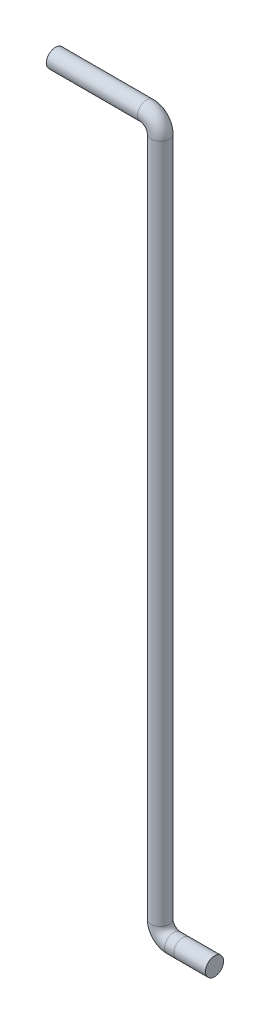
ISO-10303-21;
HEADER;
FILE_DESCRIPTION(('STEP AP214'),'2;1');
FILE_NAME('part.step','',(''),(''),'','','');
FILE_SCHEMA(('AUTOMOTIVE_DESIGN { 1 0 10303 214 1 1 1 1 }'));
ENDSEC;
DATA;
#1=APPLICATION_CONTEXT('core data for automotive mechanical design processes');
#2=APPLICATION_PROTOCOL_DEFINITION('international standard','automotive_design',2000,#1);
#3=PRODUCT_CONTEXT('',#1,'mechanical');
#4=PRODUCT('Part','Part','',(#3));
#5=PRODUCT_RELATED_PRODUCT_CATEGORY('part','',(#4));
#6=PRODUCT_DEFINITION_FORMATION('','',#4);
#7=PRODUCT_DEFINITION_CONTEXT('part definition',#1,'design');
#8=PRODUCT_DEFINITION('design','',#6,#7);
#9=PRODUCT_DEFINITION_SHAPE('','',#8);
#10=(LENGTH_UNIT() NAMED_UNIT(*) SI_UNIT(.MILLI.,.METRE.));
#11=(NAMED_UNIT(*) PLANE_ANGLE_UNIT() SI_UNIT($,.RADIAN.));
#12=(NAMED_UNIT(*) SI_UNIT($,.STERADIAN.) SOLID_ANGLE_UNIT());
#13=UNCERTAINTY_MEASURE_WITH_UNIT(LENGTH_MEASURE(1.E-05),#10,'distance_accuracy_value','');
#14=(GEOMETRIC_REPRESENTATION_CONTEXT(3) GLOBAL_UNCERTAINTY_ASSIGNED_CONTEXT((#13)) GLOBAL_UNIT_ASSIGNED_CONTEXT((#10,
#11,#12)) REPRESENTATION_CONTEXT('',''));
#15=CARTESIAN_POINT('',(0.,0.,0.));
#16=DIRECTION('',(0.,0.,1.));
#17=DIRECTION('',(1.,0.,0.));
#18=AXIS2_PLACEMENT_3D('',#15,#16,#17);
#19=CARTESIAN_POINT('',(-17.55,78.,0.));
#20=DIRECTION('',(1.,0.,0.));
#21=DIRECTION('',(0.,0.,-1.));
#22=AXIS2_PLACEMENT_3D('',#19,#20,#21);
#23=PLANE('',#22);
#24=CARTESIAN_POINT('',(-17.55,78.,0.));
#25=DIRECTION('',(1.,0.,0.));
#26=DIRECTION('',(0.,0.,-1.));
#27=AXIS2_PLACEMENT_3D('',#24,#25,#26);
#28=CIRCLE('',#27,1.);
#29=CARTESIAN_POINT('',(-17.55,78.,-1.));
#30=VERTEX_POINT('',#29);
#31=EDGE_CURVE('E52',#30,#30,#28,.T.);
#32=ORIENTED_EDGE('',*,*,#31,.F.);
#33=EDGE_LOOP('',(#32));
#34=FACE_BOUND('',#33,.T.);
#35=ADVANCED_FACE('F39',(#34),#23,.F.);
#36=CARTESIAN_POINT('',(0.,0.,0.));
#37=DIRECTION('',(1.,0.,0.));
#38=DIRECTION('',(0.,0.,-1.));
#39=AXIS2_PLACEMENT_3D('',#36,#37,#38);
#40=PLANE('',#39);
#41=CARTESIAN_POINT('',(0.,0.,0.));
#42=DIRECTION('',(1.,0.,0.));
#43=DIRECTION('',(0.,0.,-1.));
#44=AXIS2_PLACEMENT_3D('',#41,#42,#43);
#45=CIRCLE('',#44,1.);
#46=CARTESIAN_POINT('',(0.,0.,-1.));
#47=VERTEX_POINT('',#46);
#48=EDGE_CURVE('E11',#47,#47,#45,.T.);
#49=ORIENTED_EDGE('',*,*,#48,.T.);
#50=EDGE_LOOP('',(#49));
#51=FACE_BOUND('',#50,.T.);
#52=ADVANCED_FACE('F55',(#51),#40,.T.);
#53=CARTESIAN_POINT('',(-17.55,78.,0.));
#54=DIRECTION('',(1.,0.,0.));
#55=DIRECTION('',(0.,0.,-1.));
#56=AXIS2_PLACEMENT_3D('',#53,#54,#55);
#57=CYLINDRICAL_SURFACE('',#56,1.);
#58=CARTESIAN_POINT('',(-7.50000000000001,78.,0.));
#59=DIRECTION('',(1.,0.,0.));
#60=DIRECTION('',(0.,0.,-1.));
#61=AXIS2_PLACEMENT_3D('',#58,#59,#60);
#62=CIRCLE('',#61,1.);
#63=CARTESIAN_POINT('',(-7.50000000000001,79.,0.));
#64=VERTEX_POINT('',#63);
#65=EDGE_CURVE('E79',#64,#64,#62,.T.);
#66=ORIENTED_EDGE('',*,*,#65,.F.);
#67=EDGE_LOOP('',(#66));
#68=FACE_BOUND('',#67,.T.);
#69=ORIENTED_EDGE('',*,*,#31,.T.);
#70=EDGE_LOOP('',(#69));
#71=FACE_BOUND('',#70,.T.);
#72=ADVANCED_FACE('F85',(#68,#71),#57,.T.);
#73=CARTESIAN_POINT('',(-7.50000000000001,76.5,0.));
#74=DIRECTION('',(0.,0.,-1.));
#75=DIRECTION('',(-1.,0.,0.));
#76=AXIS2_PLACEMENT_3D('',#73,#74,#75);
#77=TOROIDAL_SURFACE('',#76,1.5,1.);
#78=CARTESIAN_POINT('',(-6.00000000000001,76.5,0.));
#79=DIRECTION('',(0.,-1.,0.));
#80=DIRECTION('',(0.,0.,-1.));
#81=AXIS2_PLACEMENT_3D('',#78,#79,#80);
#82=CIRCLE('',#81,1.);
#83=CARTESIAN_POINT('',(-5.00000000000001,76.5,0.));
#84=VERTEX_POINT('',#83);
#85=EDGE_CURVE('E75',#84,#84,#82,.T.);
#86=CARTESIAN_POINT('',(-7.50000000000001,76.5,0.));
#87=DIRECTION('',(0.,0.,-1.));
#88=DIRECTION('',(-1.,0.,0.));
#89=AXIS2_PLACEMENT_3D('',#86,#87,#88);
#90=CIRCLE('',#89,2.5);
#91=EDGE_CURVE('',#64,#84,#90,.T.);
#92=ORIENTED_EDGE('',*,*,#65,.T.);
#93=ORIENTED_EDGE('',*,*,#85,.F.);
#94=ORIENTED_EDGE('',*,*,#91,.T.);
#95=ORIENTED_EDGE('',*,*,#91,.F.);
#96=EDGE_LOOP('',(#92,#94,#93,#95));
#97=FACE_BOUND('',#96,.T.);
#98=ADVANCED_FACE('F87',(#97),#77,.T.);
#99=CARTESIAN_POINT('',(-6.00000000000001,76.5,0.));
#100=DIRECTION('',(0.,-1.,0.));
#101=DIRECTION('',(1.,0.,0.));
#102=AXIS2_PLACEMENT_3D('',#99,#100,#101);
#103=CYLINDRICAL_SURFACE('',#102,1.);
#104=CARTESIAN_POINT('',(-6.,1.5,0.));
#105=DIRECTION('',(0.,-1.,0.));
#106=DIRECTION('',(0.,0.,-1.));
#107=AXIS2_PLACEMENT_3D('',#104,#105,#106);
#108=CIRCLE('',#107,1.);
#109=CARTESIAN_POINT('',(-7.,1.5,0.));
#110=VERTEX_POINT('',#109);
#111=EDGE_CURVE('E69',#110,#110,#108,.T.);
#112=ORIENTED_EDGE('',*,*,#111,.F.);
#113=EDGE_LOOP('',(#112));
#114=FACE_BOUND('',#113,.T.);
#115=ORIENTED_EDGE('',*,*,#85,.T.);
#116=EDGE_LOOP('',(#115));
#117=FACE_BOUND('',#116,.T.);
#118=ADVANCED_FACE('F94',(#114,#117),#103,.T.);
#119=CARTESIAN_POINT('',(-4.5,1.5,0.));
#120=DIRECTION('',(0.,0.,1.));
#121=DIRECTION('',(1.,0.,0.));
#122=AXIS2_PLACEMENT_3D('',#119,#120,#121);
#123=TOROIDAL_SURFACE('',#122,1.5,1.);
#124=CARTESIAN_POINT('',(-4.5,0.,0.));
#125=DIRECTION('',(1.,0.,0.));
#126=DIRECTION('',(0.,0.,-1.));
#127=AXIS2_PLACEMENT_3D('',#124,#125,#126);
#128=CIRCLE('',#127,1.);
#129=CARTESIAN_POINT('',(-4.5,-0.999999999999999,0.));
#130=VERTEX_POINT('',#129);
#131=EDGE_CURVE('E66',#130,#130,#128,.T.);
#132=CARTESIAN_POINT('',(-4.5,1.5,0.));
#133=DIRECTION('',(0.,0.,1.));
#134=DIRECTION('',(1.,0.,0.));
#135=AXIS2_PLACEMENT_3D('',#132,#133,#134);
#136=CIRCLE('',#135,2.5);
#137=EDGE_CURVE('',#110,#130,#136,.T.);
#138=ORIENTED_EDGE('',*,*,#111,.T.);
#139=ORIENTED_EDGE('',*,*,#131,.F.);
#140=ORIENTED_EDGE('',*,*,#137,.T.);
#141=ORIENTED_EDGE('',*,*,#137,.F.);
#142=EDGE_LOOP('',(#138,#140,#139,#141));
#143=FACE_BOUND('',#142,.T.);
#144=ADVANCED_FACE('F101',(#143),#123,.T.);
#145=CARTESIAN_POINT('',(-4.5,0.,0.));
#146=DIRECTION('',(1.,0.,0.));
#147=DIRECTION('',(0.,0.,-1.));
#148=AXIS2_PLACEMENT_3D('',#145,#146,#147);
#149=CYLINDRICAL_SURFACE('',#148,1.);
#150=CARTESIAN_POINT('',(-3.5,0.,0.));
#151=DIRECTION('',(1.,0.,0.));
#152=DIRECTION('',(0.,0.,-1.));
#153=AXIS2_PLACEMENT_3D('',#150,#151,#152);
#154=CIRCLE('',#153,1.);
#155=CARTESIAN_POINT('',(-3.5,0.,-1.));
#156=VERTEX_POINT('',#155);
#157=EDGE_CURVE('E47',#156,#156,#154,.T.);
#158=ORIENTED_EDGE('',*,*,#157,.F.);
#159=EDGE_LOOP('',(#158));
#160=FACE_BOUND('',#159,.T.);
#161=ORIENTED_EDGE('',*,*,#131,.T.);
#162=EDGE_LOOP('',(#161));
#163=FACE_BOUND('',#162,.T.);
#164=ADVANCED_FACE('F60',(#160,#163),#149,.T.);
#165=CARTESIAN_POINT('',(-3.5,0.,0.));
#166=DIRECTION('',(1.,0.,0.));
#167=DIRECTION('',(0.,0.,-1.));
#168=AXIS2_PLACEMENT_3D('',#165,#166,#167);
#169=CYLINDRICAL_SURFACE('',#168,1.);
#170=ORIENTED_EDGE('',*,*,#48,.F.);
#171=EDGE_LOOP('',(#170));
#172=FACE_BOUND('',#171,.T.);
#173=ORIENTED_EDGE('',*,*,#157,.T.);
#174=EDGE_LOOP('',(#173));
#175=FACE_BOUND('',#174,.T.);
#176=ADVANCED_FACE('F57',(#172,#175),#169,.T.);
#177=CLOSED_SHELL('',(#35,#52,#72,#98,#118,#144,#164,#176));
#178=MANIFOLD_SOLID_BREP('B2',#177);
#179=ADVANCED_BREP_SHAPE_REPRESENTATION('',(#18,#178),#14);
#180=SHAPE_DEFINITION_REPRESENTATION(#9,#179);
ENDSEC;
END-ISO-10303-21;
